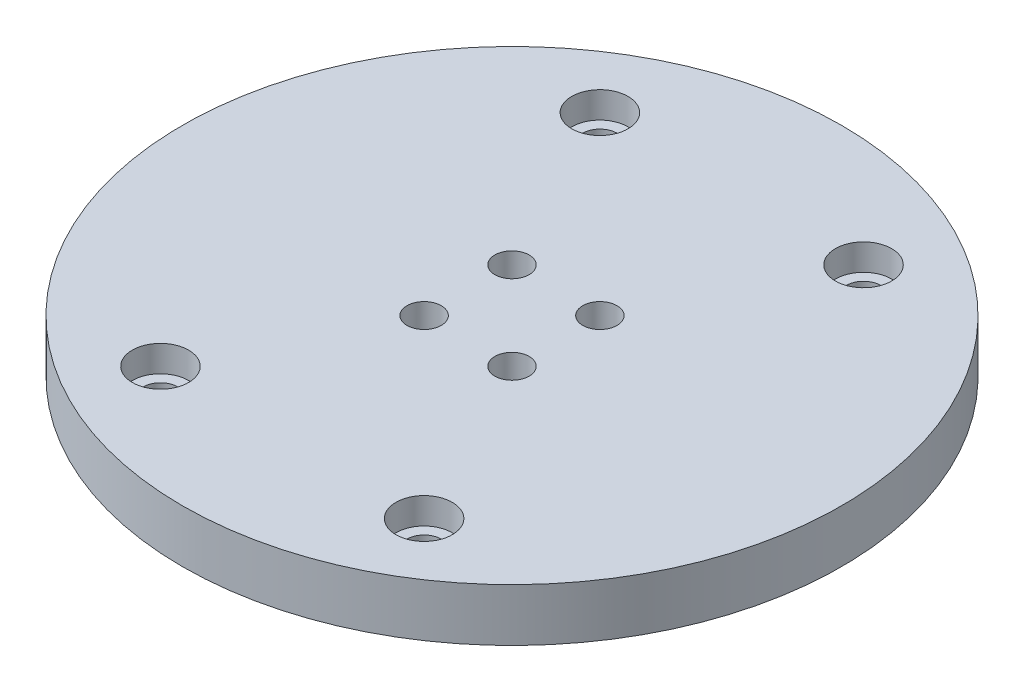
ISO-10303-21;
HEADER;
FILE_DESCRIPTION(('STEP AP214'),'2;1');
FILE_NAME('part.step','',(''),(''),'','','');
FILE_SCHEMA(('AUTOMOTIVE_DESIGN { 1 0 10303 214 1 1 1 1 }'));
ENDSEC;
DATA;
#1=APPLICATION_CONTEXT('core data for automotive mechanical design processes');
#2=APPLICATION_PROTOCOL_DEFINITION('international standard','automotive_design',2000,#1);
#3=PRODUCT_CONTEXT('',#1,'mechanical');
#4=PRODUCT('Part','Part','',(#3));
#5=PRODUCT_RELATED_PRODUCT_CATEGORY('part','',(#4));
#6=PRODUCT_DEFINITION_FORMATION('','',#4);
#7=PRODUCT_DEFINITION_CONTEXT('part definition',#1,'design');
#8=PRODUCT_DEFINITION('design','',#6,#7);
#9=PRODUCT_DEFINITION_SHAPE('','',#8);
#10=(LENGTH_UNIT() NAMED_UNIT(*) SI_UNIT(.MILLI.,.METRE.));
#11=(NAMED_UNIT(*) PLANE_ANGLE_UNIT() SI_UNIT($,.RADIAN.));
#12=(NAMED_UNIT(*) SI_UNIT($,.STERADIAN.) SOLID_ANGLE_UNIT());
#13=UNCERTAINTY_MEASURE_WITH_UNIT(LENGTH_MEASURE(1.E-05),#10,'distance_accuracy_value','');
#14=(GEOMETRIC_REPRESENTATION_CONTEXT(3) GLOBAL_UNCERTAINTY_ASSIGNED_CONTEXT((#13)) GLOBAL_UNIT_ASSIGNED_CONTEXT((#10,
#11,#12)) REPRESENTATION_CONTEXT('',''));
#15=CARTESIAN_POINT('',(0.,0.,0.));
#16=DIRECTION('',(0.,0.,1.));
#17=DIRECTION('',(1.,0.,0.));
#18=AXIS2_PLACEMENT_3D('',#15,#16,#17);
#19=CARTESIAN_POINT('',(25.,6.,-30.));
#20=DIRECTION('',(0.,-1.,0.));
#21=DIRECTION('',(0.,0.,-1.));
#22=AXIS2_PLACEMENT_3D('',#19,#20,#21);
#23=CYLINDRICAL_SURFACE('',#22,37.5);
#24=CARTESIAN_POINT('',(25.,6.,-30.));
#25=DIRECTION('',(0.,1.,0.));
#26=DIRECTION('',(0.,0.,1.));
#27=AXIS2_PLACEMENT_3D('',#24,#25,#26);
#28=CIRCLE('',#27,37.5);
#29=CARTESIAN_POINT('',(25.,6.,7.50000000000001));
#30=VERTEX_POINT('',#29);
#31=EDGE_CURVE('E10',#30,#30,#28,.T.);
#32=ORIENTED_EDGE('',*,*,#31,.F.);
#33=EDGE_LOOP('',(#32));
#34=FACE_BOUND('',#33,.T.);
#35=CARTESIAN_POINT('',(25.,0.,-30.));
#36=DIRECTION('',(0.,1.,0.));
#37=DIRECTION('',(0.,0.,1.));
#38=AXIS2_PLACEMENT_3D('',#35,#36,#37);
#39=CIRCLE('',#38,37.5);
#40=CARTESIAN_POINT('',(25.,0.,7.50000000000001));
#41=VERTEX_POINT('',#40);
#42=EDGE_CURVE('E44',#41,#41,#39,.T.);
#43=ORIENTED_EDGE('',*,*,#42,.T.);
#44=EDGE_LOOP('',(#43));
#45=FACE_BOUND('',#44,.T.);
#46=ADVANCED_FACE('F41',(#34,#45),#23,.T.);
#47=CARTESIAN_POINT('',(25.,6.,-30.));
#48=DIRECTION('',(0.,1.,0.));
#49=DIRECTION('',(0.,0.,1.));
#50=AXIS2_PLACEMENT_3D('',#47,#48,#49);
#51=PLANE('',#50);
#52=CARTESIAN_POINT('',(10.,6.,-55.));
#53=DIRECTION('',(0.,1.,0.));
#54=DIRECTION('',(0.,0.,1.));
#55=AXIS2_PLACEMENT_3D('',#52,#53,#54);
#56=CIRCLE('',#55,3.20000000000001);
#57=CARTESIAN_POINT('',(10.,6.,-51.8));
#58=VERTEX_POINT('',#57);
#59=EDGE_CURVE('E178',#58,#58,#56,.T.);
#60=ORIENTED_EDGE('',*,*,#59,.F.);
#61=EDGE_LOOP('',(#60));
#62=FACE_BOUND('',#61,.T.);
#63=CARTESIAN_POINT('',(40.,6.,-5.));
#64=DIRECTION('',(0.,1.,0.));
#65=DIRECTION('',(0.,0.,1.));
#66=AXIS2_PLACEMENT_3D('',#63,#64,#65);
#67=CIRCLE('',#66,3.20000000000002);
#68=CARTESIAN_POINT('',(40.,6.,-1.79999999999998));
#69=VERTEX_POINT('',#68);
#70=EDGE_CURVE('E162',#69,#69,#67,.T.);
#71=ORIENTED_EDGE('',*,*,#70,.F.);
#72=EDGE_LOOP('',(#71));
#73=FACE_BOUND('',#72,.T.);
#74=CARTESIAN_POINT('',(10.,6.,-5.));
#75=DIRECTION('',(0.,1.,0.));
#76=DIRECTION('',(0.,0.,1.));
#77=AXIS2_PLACEMENT_3D('',#74,#75,#76);
#78=CIRCLE('',#77,3.20000000000001);
#79=CARTESIAN_POINT('',(10.,6.,-1.79999999999998));
#80=VERTEX_POINT('',#79);
#81=EDGE_CURVE('E146',#80,#80,#78,.T.);
#82=ORIENTED_EDGE('',*,*,#81,.F.);
#83=EDGE_LOOP('',(#82));
#84=FACE_BOUND('',#83,.T.);
#85=CARTESIAN_POINT('',(40.,6.,-55.));
#86=DIRECTION('',(0.,1.,0.));
#87=DIRECTION('',(0.,0.,1.));
#88=AXIS2_PLACEMENT_3D('',#85,#86,#87);
#89=CIRCLE('',#88,3.20000000000002);
#90=CARTESIAN_POINT('',(40.,6.,-51.8));
#91=VERTEX_POINT('',#90);
#92=EDGE_CURVE('E130',#91,#91,#89,.T.);
#93=ORIENTED_EDGE('',*,*,#92,.F.);
#94=EDGE_LOOP('',(#93));
#95=FACE_BOUND('',#94,.T.);
#96=CARTESIAN_POINT('',(20.,6.,-25.));
#97=DIRECTION('',(0.,-1.,0.));
#98=DIRECTION('',(0.,0.,-1.));
#99=AXIS2_PLACEMENT_3D('',#96,#97,#98);
#100=CIRCLE('',#99,1.95000000000001);
#101=CARTESIAN_POINT('',(20.,6.,-26.95));
#102=VERTEX_POINT('',#101);
#103=EDGE_CURVE('E102',#102,#102,#100,.T.);
#104=ORIENTED_EDGE('',*,*,#103,.T.);
#105=EDGE_LOOP('',(#104));
#106=FACE_BOUND('',#105,.T.);
#107=CARTESIAN_POINT('',(30.,6.,-25.));
#108=DIRECTION('',(0.,-1.,0.));
#109=DIRECTION('',(0.,0.,-1.));
#110=AXIS2_PLACEMENT_3D('',#107,#108,#109);
#111=CIRCLE('',#110,1.95000000000001);
#112=CARTESIAN_POINT('',(30.,6.,-26.95));
#113=VERTEX_POINT('',#112);
#114=EDGE_CURVE('E86',#113,#113,#111,.T.);
#115=ORIENTED_EDGE('',*,*,#114,.T.);
#116=EDGE_LOOP('',(#115));
#117=FACE_BOUND('',#116,.T.);
#118=CARTESIAN_POINT('',(30.,6.,-35.));
#119=DIRECTION('',(0.,-1.,0.));
#120=DIRECTION('',(0.,0.,-1.));
#121=AXIS2_PLACEMENT_3D('',#118,#119,#120);
#122=CIRCLE('',#121,1.95000000000001);
#123=CARTESIAN_POINT('',(30.,6.,-36.95));
#124=VERTEX_POINT('',#123);
#125=EDGE_CURVE('E70',#124,#124,#122,.T.);
#126=ORIENTED_EDGE('',*,*,#125,.T.);
#127=EDGE_LOOP('',(#126));
#128=FACE_BOUND('',#127,.T.);
#129=CARTESIAN_POINT('',(20.,6.,-35.));
#130=DIRECTION('',(0.,-1.,0.));
#131=DIRECTION('',(0.,0.,-1.));
#132=AXIS2_PLACEMENT_3D('',#129,#130,#131);
#133=CIRCLE('',#132,1.95000000000001);
#134=CARTESIAN_POINT('',(20.,6.,-36.95));
#135=VERTEX_POINT('',#134);
#136=EDGE_CURVE('E53',#135,#135,#133,.T.);
#137=ORIENTED_EDGE('',*,*,#136,.T.);
#138=EDGE_LOOP('',(#137));
#139=FACE_BOUND('',#138,.T.);
#140=ORIENTED_EDGE('',*,*,#31,.T.);
#141=EDGE_LOOP('',(#140));
#142=FACE_BOUND('',#141,.T.);
#143=ADVANCED_FACE('F185',(#62,#73,#84,#95,#106,#117,#128,#139,#142),#51,.T.);
#144=CARTESIAN_POINT('',(25.,0.,-30.));
#145=DIRECTION('',(0.,1.,0.));
#146=DIRECTION('',(0.,0.,1.));
#147=AXIS2_PLACEMENT_3D('',#144,#145,#146);
#148=PLANE('',#147);
#149=CARTESIAN_POINT('',(10.,0.,-55.));
#150=DIRECTION('',(0.,1.,0.));
#151=DIRECTION('',(0.,0.,1.));
#152=AXIS2_PLACEMENT_3D('',#149,#150,#151);
#153=CIRCLE('',#152,1.95000000000001);
#154=CARTESIAN_POINT('',(10.,0.,-53.05));
#155=VERTEX_POINT('',#154);
#156=EDGE_CURVE('E166',#155,#155,#153,.T.);
#157=ORIENTED_EDGE('',*,*,#156,.T.);
#158=EDGE_LOOP('',(#157));
#159=FACE_BOUND('',#158,.T.);
#160=CARTESIAN_POINT('',(40.,0.,-5.));
#161=DIRECTION('',(0.,1.,0.));
#162=DIRECTION('',(0.,0.,1.));
#163=AXIS2_PLACEMENT_3D('',#160,#161,#162);
#164=CIRCLE('',#163,1.95000000000001);
#165=CARTESIAN_POINT('',(40.,0.,-3.04999999999998));
#166=VERTEX_POINT('',#165);
#167=EDGE_CURVE('E150',#166,#166,#164,.T.);
#168=ORIENTED_EDGE('',*,*,#167,.T.);
#169=EDGE_LOOP('',(#168));
#170=FACE_BOUND('',#169,.T.);
#171=CARTESIAN_POINT('',(10.,0.,-5.));
#172=DIRECTION('',(0.,1.,0.));
#173=DIRECTION('',(0.,0.,1.));
#174=AXIS2_PLACEMENT_3D('',#171,#172,#173);
#175=CIRCLE('',#174,1.95000000000001);
#176=CARTESIAN_POINT('',(10.,0.,-3.04999999999998));
#177=VERTEX_POINT('',#176);
#178=EDGE_CURVE('E134',#177,#177,#175,.T.);
#179=ORIENTED_EDGE('',*,*,#178,.T.);
#180=EDGE_LOOP('',(#179));
#181=FACE_BOUND('',#180,.T.);
#182=CARTESIAN_POINT('',(40.,0.,-55.));
#183=DIRECTION('',(0.,1.,0.));
#184=DIRECTION('',(0.,0.,1.));
#185=AXIS2_PLACEMENT_3D('',#182,#183,#184);
#186=CIRCLE('',#185,1.95000000000001);
#187=CARTESIAN_POINT('',(40.,0.,-53.05));
#188=VERTEX_POINT('',#187);
#189=EDGE_CURVE('E118',#188,#188,#186,.T.);
#190=ORIENTED_EDGE('',*,*,#189,.T.);
#191=EDGE_LOOP('',(#190));
#192=FACE_BOUND('',#191,.T.);
#193=CARTESIAN_POINT('',(20.,0.,-25.));
#194=DIRECTION('',(0.,-1.,0.));
#195=DIRECTION('',(0.,0.,-1.));
#196=AXIS2_PLACEMENT_3D('',#193,#194,#195);
#197=CIRCLE('',#196,3.15000000000001);
#198=CARTESIAN_POINT('',(20.,0.,-28.15));
#199=VERTEX_POINT('',#198);
#200=EDGE_CURVE('E114',#199,#199,#197,.T.);
#201=ORIENTED_EDGE('',*,*,#200,.F.);
#202=EDGE_LOOP('',(#201));
#203=FACE_BOUND('',#202,.T.);
#204=CARTESIAN_POINT('',(30.,0.,-25.));
#205=DIRECTION('',(0.,-1.,0.));
#206=DIRECTION('',(0.,0.,-1.));
#207=AXIS2_PLACEMENT_3D('',#204,#205,#206);
#208=CIRCLE('',#207,3.15000000000001);
#209=CARTESIAN_POINT('',(30.,0.,-28.15));
#210=VERTEX_POINT('',#209);
#211=EDGE_CURVE('E98',#210,#210,#208,.T.);
#212=ORIENTED_EDGE('',*,*,#211,.F.);
#213=EDGE_LOOP('',(#212));
#214=FACE_BOUND('',#213,.T.);
#215=CARTESIAN_POINT('',(30.,0.,-35.));
#216=DIRECTION('',(0.,-1.,0.));
#217=DIRECTION('',(0.,0.,-1.));
#218=AXIS2_PLACEMENT_3D('',#215,#216,#217);
#219=CIRCLE('',#218,3.15000000000001);
#220=CARTESIAN_POINT('',(30.,0.,-38.15));
#221=VERTEX_POINT('',#220);
#222=EDGE_CURVE('E82',#221,#221,#219,.T.);
#223=ORIENTED_EDGE('',*,*,#222,.F.);
#224=EDGE_LOOP('',(#223));
#225=FACE_BOUND('',#224,.T.);
#226=CARTESIAN_POINT('',(20.,0.,-35.));
#227=DIRECTION('',(0.,-1.,0.));
#228=DIRECTION('',(0.,0.,-1.));
#229=AXIS2_PLACEMENT_3D('',#226,#227,#228);
#230=CIRCLE('',#229,3.15000000000001);
#231=CARTESIAN_POINT('',(20.,0.,-38.15));
#232=VERTEX_POINT('',#231);
#233=EDGE_CURVE('E66',#232,#232,#230,.T.);
#234=ORIENTED_EDGE('',*,*,#233,.F.);
#235=EDGE_LOOP('',(#234));
#236=FACE_BOUND('',#235,.T.);
#237=ORIENTED_EDGE('',*,*,#42,.F.);
#238=EDGE_LOOP('',(#237));
#239=FACE_BOUND('',#238,.T.);
#240=ADVANCED_FACE('F188',(#159,#170,#181,#192,#203,#214,#225,#236,#239),#148,.F.);
#241=CARTESIAN_POINT('',(20.,0.,-35.));
#242=DIRECTION('',(0.,-1.,0.));
#243=DIRECTION('',(0.,0.,-1.));
#244=AXIS2_PLACEMENT_3D('',#241,#242,#243);
#245=CYLINDRICAL_SURFACE('',#244,1.95000000000001);
#246=ORIENTED_EDGE('',*,*,#136,.F.);
#247=EDGE_LOOP('',(#246));
#248=FACE_BOUND('',#247,.T.);
#249=CARTESIAN_POINT('',(20.,3.,-35.));
#250=DIRECTION('',(0.,-1.,0.));
#251=DIRECTION('',(0.,0.,-1.));
#252=AXIS2_PLACEMENT_3D('',#249,#250,#251);
#253=CIRCLE('',#252,1.95000000000001);
#254=CARTESIAN_POINT('',(20.,3.,-36.95));
#255=VERTEX_POINT('',#254);
#256=EDGE_CURVE('E58',#255,#255,#253,.T.);
#257=ORIENTED_EDGE('',*,*,#256,.T.);
#258=EDGE_LOOP('',(#257));
#259=FACE_BOUND('',#258,.T.);
#260=ADVANCED_FACE('F204',(#248,#259),#245,.F.);
#261=CARTESIAN_POINT('',(21.95,3.,-35.));
#262=DIRECTION('',(0.,1.,0.));
#263=DIRECTION('',(0.,0.,1.));
#264=AXIS2_PLACEMENT_3D('',#261,#262,#263);
#265=PLANE('',#264);
#266=ORIENTED_EDGE('',*,*,#256,.F.);
#267=EDGE_LOOP('',(#266));
#268=FACE_BOUND('',#267,.T.);
#269=CARTESIAN_POINT('',(20.,3.,-35.));
#270=DIRECTION('',(0.,-1.,0.));
#271=DIRECTION('',(0.,0.,-1.));
#272=AXIS2_PLACEMENT_3D('',#269,#270,#271);
#273=CIRCLE('',#272,3.15000000000001);
#274=CARTESIAN_POINT('',(20.,3.,-38.15));
#275=VERTEX_POINT('',#274);
#276=EDGE_CURVE('E62',#275,#275,#273,.T.);
#277=ORIENTED_EDGE('',*,*,#276,.T.);
#278=EDGE_LOOP('',(#277));
#279=FACE_BOUND('',#278,.T.);
#280=ADVANCED_FACE('F207',(#268,#279),#265,.F.);
#281=CARTESIAN_POINT('',(20.,0.,-35.));
#282=DIRECTION('',(0.,-1.,0.));
#283=DIRECTION('',(0.,0.,-1.));
#284=AXIS2_PLACEMENT_3D('',#281,#282,#283);
#285=CYLINDRICAL_SURFACE('',#284,3.15000000000001);
#286=ORIENTED_EDGE('',*,*,#276,.F.);
#287=EDGE_LOOP('',(#286));
#288=FACE_BOUND('',#287,.T.);
#289=ORIENTED_EDGE('',*,*,#233,.T.);
#290=EDGE_LOOP('',(#289));
#291=FACE_BOUND('',#290,.T.);
#292=ADVANCED_FACE('F213',(#288,#291),#285,.F.);
#293=CARTESIAN_POINT('',(30.,0.,-35.));
#294=DIRECTION('',(0.,-1.,0.));
#295=DIRECTION('',(0.,0.,-1.));
#296=AXIS2_PLACEMENT_3D('',#293,#294,#295);
#297=CYLINDRICAL_SURFACE('',#296,1.95000000000001);
#298=ORIENTED_EDGE('',*,*,#125,.F.);
#299=EDGE_LOOP('',(#298));
#300=FACE_BOUND('',#299,.T.);
#301=CARTESIAN_POINT('',(30.,3.,-35.));
#302=DIRECTION('',(0.,-1.,0.));
#303=DIRECTION('',(0.,0.,-1.));
#304=AXIS2_PLACEMENT_3D('',#301,#302,#303);
#305=CIRCLE('',#304,1.95000000000001);
#306=CARTESIAN_POINT('',(30.,3.,-36.95));
#307=VERTEX_POINT('',#306);
#308=EDGE_CURVE('E74',#307,#307,#305,.T.);
#309=ORIENTED_EDGE('',*,*,#308,.T.);
#310=EDGE_LOOP('',(#309));
#311=FACE_BOUND('',#310,.T.);
#312=ADVANCED_FACE('F219',(#300,#311),#297,.F.);
#313=CARTESIAN_POINT('',(31.95,3.,-35.));
#314=DIRECTION('',(0.,1.,0.));
#315=DIRECTION('',(0.,0.,1.));
#316=AXIS2_PLACEMENT_3D('',#313,#314,#315);
#317=PLANE('',#316);
#318=ORIENTED_EDGE('',*,*,#308,.F.);
#319=EDGE_LOOP('',(#318));
#320=FACE_BOUND('',#319,.T.);
#321=CARTESIAN_POINT('',(30.,3.,-35.));
#322=DIRECTION('',(0.,-1.,0.));
#323=DIRECTION('',(0.,0.,-1.));
#324=AXIS2_PLACEMENT_3D('',#321,#322,#323);
#325=CIRCLE('',#324,3.15000000000001);
#326=CARTESIAN_POINT('',(30.,3.,-38.15));
#327=VERTEX_POINT('',#326);
#328=EDGE_CURVE('E78',#327,#327,#325,.T.);
#329=ORIENTED_EDGE('',*,*,#328,.T.);
#330=EDGE_LOOP('',(#329));
#331=FACE_BOUND('',#330,.T.);
#332=ADVANCED_FACE('F255',(#320,#331),#317,.F.);
#333=CARTESIAN_POINT('',(30.,0.,-35.));
#334=DIRECTION('',(0.,-1.,0.));
#335=DIRECTION('',(0.,0.,-1.));
#336=AXIS2_PLACEMENT_3D('',#333,#334,#335);
#337=CYLINDRICAL_SURFACE('',#336,3.15000000000001);
#338=ORIENTED_EDGE('',*,*,#328,.F.);
#339=EDGE_LOOP('',(#338));
#340=FACE_BOUND('',#339,.T.);
#341=ORIENTED_EDGE('',*,*,#222,.T.);
#342=EDGE_LOOP('',(#341));
#343=FACE_BOUND('',#342,.T.);
#344=ADVANCED_FACE('F263',(#340,#343),#337,.F.);
#345=CARTESIAN_POINT('',(30.,0.,-25.));
#346=DIRECTION('',(0.,-1.,0.));
#347=DIRECTION('',(0.,0.,-1.));
#348=AXIS2_PLACEMENT_3D('',#345,#346,#347);
#349=CYLINDRICAL_SURFACE('',#348,1.95000000000001);
#350=ORIENTED_EDGE('',*,*,#114,.F.);
#351=EDGE_LOOP('',(#350));
#352=FACE_BOUND('',#351,.T.);
#353=CARTESIAN_POINT('',(30.,3.,-25.));
#354=DIRECTION('',(0.,-1.,0.));
#355=DIRECTION('',(0.,0.,-1.));
#356=AXIS2_PLACEMENT_3D('',#353,#354,#355);
#357=CIRCLE('',#356,1.95000000000001);
#358=CARTESIAN_POINT('',(30.,3.,-26.95));
#359=VERTEX_POINT('',#358);
#360=EDGE_CURVE('E90',#359,#359,#357,.T.);
#361=ORIENTED_EDGE('',*,*,#360,.T.);
#362=EDGE_LOOP('',(#361));
#363=FACE_BOUND('',#362,.T.);
#364=ADVANCED_FACE('F271',(#352,#363),#349,.F.);
#365=CARTESIAN_POINT('',(31.95,3.,-25.));
#366=DIRECTION('',(0.,1.,0.));
#367=DIRECTION('',(0.,0.,1.));
#368=AXIS2_PLACEMENT_3D('',#365,#366,#367);
#369=PLANE('',#368);
#370=ORIENTED_EDGE('',*,*,#360,.F.);
#371=EDGE_LOOP('',(#370));
#372=FACE_BOUND('',#371,.T.);
#373=CARTESIAN_POINT('',(30.,3.,-25.));
#374=DIRECTION('',(0.,-1.,0.));
#375=DIRECTION('',(0.,0.,-1.));
#376=AXIS2_PLACEMENT_3D('',#373,#374,#375);
#377=CIRCLE('',#376,3.15000000000001);
#378=CARTESIAN_POINT('',(30.,3.,-28.15));
#379=VERTEX_POINT('',#378);
#380=EDGE_CURVE('E94',#379,#379,#377,.T.);
#381=ORIENTED_EDGE('',*,*,#380,.T.);
#382=EDGE_LOOP('',(#381));
#383=FACE_BOUND('',#382,.T.);
#384=ADVANCED_FACE('F279',(#372,#383),#369,.F.);
#385=CARTESIAN_POINT('',(30.,0.,-25.));
#386=DIRECTION('',(0.,-1.,0.));
#387=DIRECTION('',(0.,0.,-1.));
#388=AXIS2_PLACEMENT_3D('',#385,#386,#387);
#389=CYLINDRICAL_SURFACE('',#388,3.15000000000001);
#390=ORIENTED_EDGE('',*,*,#380,.F.);
#391=EDGE_LOOP('',(#390));
#392=FACE_BOUND('',#391,.T.);
#393=ORIENTED_EDGE('',*,*,#211,.T.);
#394=EDGE_LOOP('',(#393));
#395=FACE_BOUND('',#394,.T.);
#396=ADVANCED_FACE('F287',(#392,#395),#389,.F.);
#397=CARTESIAN_POINT('',(20.,0.,-25.));
#398=DIRECTION('',(0.,-1.,0.));
#399=DIRECTION('',(0.,0.,-1.));
#400=AXIS2_PLACEMENT_3D('',#397,#398,#399);
#401=CYLINDRICAL_SURFACE('',#400,1.95000000000001);
#402=ORIENTED_EDGE('',*,*,#103,.F.);
#403=EDGE_LOOP('',(#402));
#404=FACE_BOUND('',#403,.T.);
#405=CARTESIAN_POINT('',(20.,3.,-25.));
#406=DIRECTION('',(0.,-1.,0.));
#407=DIRECTION('',(0.,0.,-1.));
#408=AXIS2_PLACEMENT_3D('',#405,#406,#407);
#409=CIRCLE('',#408,1.95000000000001);
#410=CARTESIAN_POINT('',(20.,3.,-26.95));
#411=VERTEX_POINT('',#410);
#412=EDGE_CURVE('E106',#411,#411,#409,.T.);
#413=ORIENTED_EDGE('',*,*,#412,.T.);
#414=EDGE_LOOP('',(#413));
#415=FACE_BOUND('',#414,.T.);
#416=ADVANCED_FACE('F295',(#404,#415),#401,.F.);
#417=CARTESIAN_POINT('',(21.95,3.,-25.));
#418=DIRECTION('',(0.,1.,0.));
#419=DIRECTION('',(0.,0.,1.));
#420=AXIS2_PLACEMENT_3D('',#417,#418,#419);
#421=PLANE('',#420);
#422=ORIENTED_EDGE('',*,*,#412,.F.);
#423=EDGE_LOOP('',(#422));
#424=FACE_BOUND('',#423,.T.);
#425=CARTESIAN_POINT('',(20.,3.,-25.));
#426=DIRECTION('',(0.,-1.,0.));
#427=DIRECTION('',(0.,0.,-1.));
#428=AXIS2_PLACEMENT_3D('',#425,#426,#427);
#429=CIRCLE('',#428,3.15000000000001);
#430=CARTESIAN_POINT('',(20.,3.,-28.15));
#431=VERTEX_POINT('',#430);
#432=EDGE_CURVE('E110',#431,#431,#429,.T.);
#433=ORIENTED_EDGE('',*,*,#432,.T.);
#434=EDGE_LOOP('',(#433));
#435=FACE_BOUND('',#434,.T.);
#436=ADVANCED_FACE('F303',(#424,#435),#421,.F.);
#437=CARTESIAN_POINT('',(20.,0.,-25.));
#438=DIRECTION('',(0.,-1.,0.));
#439=DIRECTION('',(0.,0.,-1.));
#440=AXIS2_PLACEMENT_3D('',#437,#438,#439);
#441=CYLINDRICAL_SURFACE('',#440,3.15000000000001);
#442=ORIENTED_EDGE('',*,*,#432,.F.);
#443=EDGE_LOOP('',(#442));
#444=FACE_BOUND('',#443,.T.);
#445=ORIENTED_EDGE('',*,*,#200,.T.);
#446=EDGE_LOOP('',(#445));
#447=FACE_BOUND('',#446,.T.);
#448=ADVANCED_FACE('F311',(#444,#447),#441,.F.);
#449=CARTESIAN_POINT('',(40.,6.,-55.));
#450=DIRECTION('',(0.,1.,0.));
#451=DIRECTION('',(0.,0.,1.));
#452=AXIS2_PLACEMENT_3D('',#449,#450,#451);
#453=CYLINDRICAL_SURFACE('',#452,1.95000000000001);
#454=ORIENTED_EDGE('',*,*,#189,.F.);
#455=EDGE_LOOP('',(#454));
#456=FACE_BOUND('',#455,.T.);
#457=CARTESIAN_POINT('',(40.,3.,-55.));
#458=DIRECTION('',(0.,1.,0.));
#459=DIRECTION('',(0.,0.,1.));
#460=AXIS2_PLACEMENT_3D('',#457,#458,#459);
#461=CIRCLE('',#460,1.95000000000001);
#462=CARTESIAN_POINT('',(40.,3.,-53.05));
#463=VERTEX_POINT('',#462);
#464=EDGE_CURVE('E122',#463,#463,#461,.T.);
#465=ORIENTED_EDGE('',*,*,#464,.T.);
#466=EDGE_LOOP('',(#465));
#467=FACE_BOUND('',#466,.T.);
#468=ADVANCED_FACE('F319',(#456,#467),#453,.F.);
#469=CARTESIAN_POINT('',(41.95,3.,-55.));
#470=DIRECTION('',(0.,-1.,0.));
#471=DIRECTION('',(0.,0.,-1.));
#472=AXIS2_PLACEMENT_3D('',#469,#470,#471);
#473=PLANE('',#472);
#474=ORIENTED_EDGE('',*,*,#464,.F.);
#475=EDGE_LOOP('',(#474));
#476=FACE_BOUND('',#475,.T.);
#477=CARTESIAN_POINT('',(40.,3.,-55.));
#478=DIRECTION('',(0.,1.,0.));
#479=DIRECTION('',(0.,0.,1.));
#480=AXIS2_PLACEMENT_3D('',#477,#478,#479);
#481=CIRCLE('',#480,3.20000000000002);
#482=CARTESIAN_POINT('',(40.,3.,-51.8));
#483=VERTEX_POINT('',#482);
#484=EDGE_CURVE('E126',#483,#483,#481,.T.);
#485=ORIENTED_EDGE('',*,*,#484,.T.);
#486=EDGE_LOOP('',(#485));
#487=FACE_BOUND('',#486,.T.);
#488=ADVANCED_FACE('F327',(#476,#487),#473,.F.);
#489=CARTESIAN_POINT('',(40.,6.,-55.));
#490=DIRECTION('',(0.,1.,0.));
#491=DIRECTION('',(0.,0.,1.));
#492=AXIS2_PLACEMENT_3D('',#489,#490,#491);
#493=CYLINDRICAL_SURFACE('',#492,3.20000000000002);
#494=ORIENTED_EDGE('',*,*,#484,.F.);
#495=EDGE_LOOP('',(#494));
#496=FACE_BOUND('',#495,.T.);
#497=ORIENTED_EDGE('',*,*,#92,.T.);
#498=EDGE_LOOP('',(#497));
#499=FACE_BOUND('',#498,.T.);
#500=ADVANCED_FACE('F335',(#496,#499),#493,.F.);
#501=CARTESIAN_POINT('',(10.,6.,-5.));
#502=DIRECTION('',(0.,1.,0.));
#503=DIRECTION('',(0.,0.,1.));
#504=AXIS2_PLACEMENT_3D('',#501,#502,#503);
#505=CYLINDRICAL_SURFACE('',#504,1.95000000000001);
#506=ORIENTED_EDGE('',*,*,#178,.F.);
#507=EDGE_LOOP('',(#506));
#508=FACE_BOUND('',#507,.T.);
#509=CARTESIAN_POINT('',(10.,3.,-5.));
#510=DIRECTION('',(0.,1.,0.));
#511=DIRECTION('',(0.,0.,1.));
#512=AXIS2_PLACEMENT_3D('',#509,#510,#511);
#513=CIRCLE('',#512,1.95000000000001);
#514=CARTESIAN_POINT('',(10.,3.,-3.04999999999998));
#515=VERTEX_POINT('',#514);
#516=EDGE_CURVE('E138',#515,#515,#513,.T.);
#517=ORIENTED_EDGE('',*,*,#516,.T.);
#518=EDGE_LOOP('',(#517));
#519=FACE_BOUND('',#518,.T.);
#520=ADVANCED_FACE('F343',(#508,#519),#505,.F.);
#521=CARTESIAN_POINT('',(11.95,3.,-5.));
#522=DIRECTION('',(0.,-1.,0.));
#523=DIRECTION('',(0.,0.,-1.));
#524=AXIS2_PLACEMENT_3D('',#521,#522,#523);
#525=PLANE('',#524);
#526=ORIENTED_EDGE('',*,*,#516,.F.);
#527=EDGE_LOOP('',(#526));
#528=FACE_BOUND('',#527,.T.);
#529=CARTESIAN_POINT('',(10.,3.,-5.));
#530=DIRECTION('',(0.,1.,0.));
#531=DIRECTION('',(0.,0.,1.));
#532=AXIS2_PLACEMENT_3D('',#529,#530,#531);
#533=CIRCLE('',#532,3.20000000000001);
#534=CARTESIAN_POINT('',(10.,3.,-1.79999999999998));
#535=VERTEX_POINT('',#534);
#536=EDGE_CURVE('E142',#535,#535,#533,.T.);
#537=ORIENTED_EDGE('',*,*,#536,.T.);
#538=EDGE_LOOP('',(#537));
#539=FACE_BOUND('',#538,.T.);
#540=ADVANCED_FACE('F351',(#528,#539),#525,.F.);
#541=CARTESIAN_POINT('',(10.,6.,-5.));
#542=DIRECTION('',(0.,1.,0.));
#543=DIRECTION('',(0.,0.,1.));
#544=AXIS2_PLACEMENT_3D('',#541,#542,#543);
#545=CYLINDRICAL_SURFACE('',#544,3.20000000000001);
#546=ORIENTED_EDGE('',*,*,#536,.F.);
#547=EDGE_LOOP('',(#546));
#548=FACE_BOUND('',#547,.T.);
#549=ORIENTED_EDGE('',*,*,#81,.T.);
#550=EDGE_LOOP('',(#549));
#551=FACE_BOUND('',#550,.T.);
#552=ADVANCED_FACE('F359',(#548,#551),#545,.F.);
#553=CARTESIAN_POINT('',(40.,6.,-5.));
#554=DIRECTION('',(0.,1.,0.));
#555=DIRECTION('',(0.,0.,1.));
#556=AXIS2_PLACEMENT_3D('',#553,#554,#555);
#557=CYLINDRICAL_SURFACE('',#556,1.95000000000001);
#558=ORIENTED_EDGE('',*,*,#167,.F.);
#559=EDGE_LOOP('',(#558));
#560=FACE_BOUND('',#559,.T.);
#561=CARTESIAN_POINT('',(40.,3.,-5.));
#562=DIRECTION('',(0.,1.,0.));
#563=DIRECTION('',(0.,0.,1.));
#564=AXIS2_PLACEMENT_3D('',#561,#562,#563);
#565=CIRCLE('',#564,1.95000000000001);
#566=CARTESIAN_POINT('',(40.,3.,-3.04999999999998));
#567=VERTEX_POINT('',#566);
#568=EDGE_CURVE('E154',#567,#567,#565,.T.);
#569=ORIENTED_EDGE('',*,*,#568,.T.);
#570=EDGE_LOOP('',(#569));
#571=FACE_BOUND('',#570,.T.);
#572=ADVANCED_FACE('F367',(#560,#571),#557,.F.);
#573=CARTESIAN_POINT('',(41.95,3.,-5.));
#574=DIRECTION('',(0.,-1.,0.));
#575=DIRECTION('',(0.,0.,-1.));
#576=AXIS2_PLACEMENT_3D('',#573,#574,#575);
#577=PLANE('',#576);
#578=ORIENTED_EDGE('',*,*,#568,.F.);
#579=EDGE_LOOP('',(#578));
#580=FACE_BOUND('',#579,.T.);
#581=CARTESIAN_POINT('',(40.,3.,-5.));
#582=DIRECTION('',(0.,1.,0.));
#583=DIRECTION('',(0.,0.,1.));
#584=AXIS2_PLACEMENT_3D('',#581,#582,#583);
#585=CIRCLE('',#584,3.20000000000002);
#586=CARTESIAN_POINT('',(40.,3.,-1.79999999999998));
#587=VERTEX_POINT('',#586);
#588=EDGE_CURVE('E158',#587,#587,#585,.T.);
#589=ORIENTED_EDGE('',*,*,#588,.T.);
#590=EDGE_LOOP('',(#589));
#591=FACE_BOUND('',#590,.T.);
#592=ADVANCED_FACE('F375',(#580,#591),#577,.F.);
#593=CARTESIAN_POINT('',(40.,6.,-5.));
#594=DIRECTION('',(0.,1.,0.));
#595=DIRECTION('',(0.,0.,1.));
#596=AXIS2_PLACEMENT_3D('',#593,#594,#595);
#597=CYLINDRICAL_SURFACE('',#596,3.20000000000002);
#598=ORIENTED_EDGE('',*,*,#588,.F.);
#599=EDGE_LOOP('',(#598));
#600=FACE_BOUND('',#599,.T.);
#601=ORIENTED_EDGE('',*,*,#70,.T.);
#602=EDGE_LOOP('',(#601));
#603=FACE_BOUND('',#602,.T.);
#604=ADVANCED_FACE('F383',(#600,#603),#597,.F.);
#605=CARTESIAN_POINT('',(10.,6.,-55.));
#606=DIRECTION('',(0.,1.,0.));
#607=DIRECTION('',(0.,0.,1.));
#608=AXIS2_PLACEMENT_3D('',#605,#606,#607);
#609=CYLINDRICAL_SURFACE('',#608,1.95000000000001);
#610=ORIENTED_EDGE('',*,*,#156,.F.);
#611=EDGE_LOOP('',(#610));
#612=FACE_BOUND('',#611,.T.);
#613=CARTESIAN_POINT('',(10.,3.,-55.));
#614=DIRECTION('',(0.,1.,0.));
#615=DIRECTION('',(0.,0.,1.));
#616=AXIS2_PLACEMENT_3D('',#613,#614,#615);
#617=CIRCLE('',#616,1.95000000000001);
#618=CARTESIAN_POINT('',(10.,3.,-53.05));
#619=VERTEX_POINT('',#618);
#620=EDGE_CURVE('E170',#619,#619,#617,.T.);
#621=ORIENTED_EDGE('',*,*,#620,.T.);
#622=EDGE_LOOP('',(#621));
#623=FACE_BOUND('',#622,.T.);
#624=ADVANCED_FACE('F391',(#612,#623),#609,.F.);
#625=CARTESIAN_POINT('',(11.95,3.,-55.));
#626=DIRECTION('',(0.,-1.,0.));
#627=DIRECTION('',(0.,0.,-1.));
#628=AXIS2_PLACEMENT_3D('',#625,#626,#627);
#629=PLANE('',#628);
#630=ORIENTED_EDGE('',*,*,#620,.F.);
#631=EDGE_LOOP('',(#630));
#632=FACE_BOUND('',#631,.T.);
#633=CARTESIAN_POINT('',(10.,3.,-55.));
#634=DIRECTION('',(0.,1.,0.));
#635=DIRECTION('',(0.,0.,1.));
#636=AXIS2_PLACEMENT_3D('',#633,#634,#635);
#637=CIRCLE('',#636,3.20000000000001);
#638=CARTESIAN_POINT('',(10.,3.,-51.8));
#639=VERTEX_POINT('',#638);
#640=EDGE_CURVE('E174',#639,#639,#637,.T.);
#641=ORIENTED_EDGE('',*,*,#640,.T.);
#642=EDGE_LOOP('',(#641));
#643=FACE_BOUND('',#642,.T.);
#644=ADVANCED_FACE('F399',(#632,#643),#629,.F.);
#645=CARTESIAN_POINT('',(10.,6.,-55.));
#646=DIRECTION('',(0.,1.,0.));
#647=DIRECTION('',(0.,0.,1.));
#648=AXIS2_PLACEMENT_3D('',#645,#646,#647);
#649=CYLINDRICAL_SURFACE('',#648,3.20000000000001);
#650=ORIENTED_EDGE('',*,*,#640,.F.);
#651=EDGE_LOOP('',(#650));
#652=FACE_BOUND('',#651,.T.);
#653=ORIENTED_EDGE('',*,*,#59,.T.);
#654=EDGE_LOOP('',(#653));
#655=FACE_BOUND('',#654,.T.);
#656=ADVANCED_FACE('F183',(#652,#655),#649,.F.);
#657=CLOSED_SHELL('',(#46,#143,#240,#260,#280,#292,#312,#332,#344,#364,#384,#396,#416,#436,#448,
#468,#488,#500,#520,#540,#552,#572,#592,#604,#624,#644,#656));
#658=MANIFOLD_SOLID_BREP('B2',#657);
#659=ADVANCED_BREP_SHAPE_REPRESENTATION('',(#18,#658),#14);
#660=SHAPE_DEFINITION_REPRESENTATION(#9,#659);
ENDSEC;
END-ISO-10303-21;
